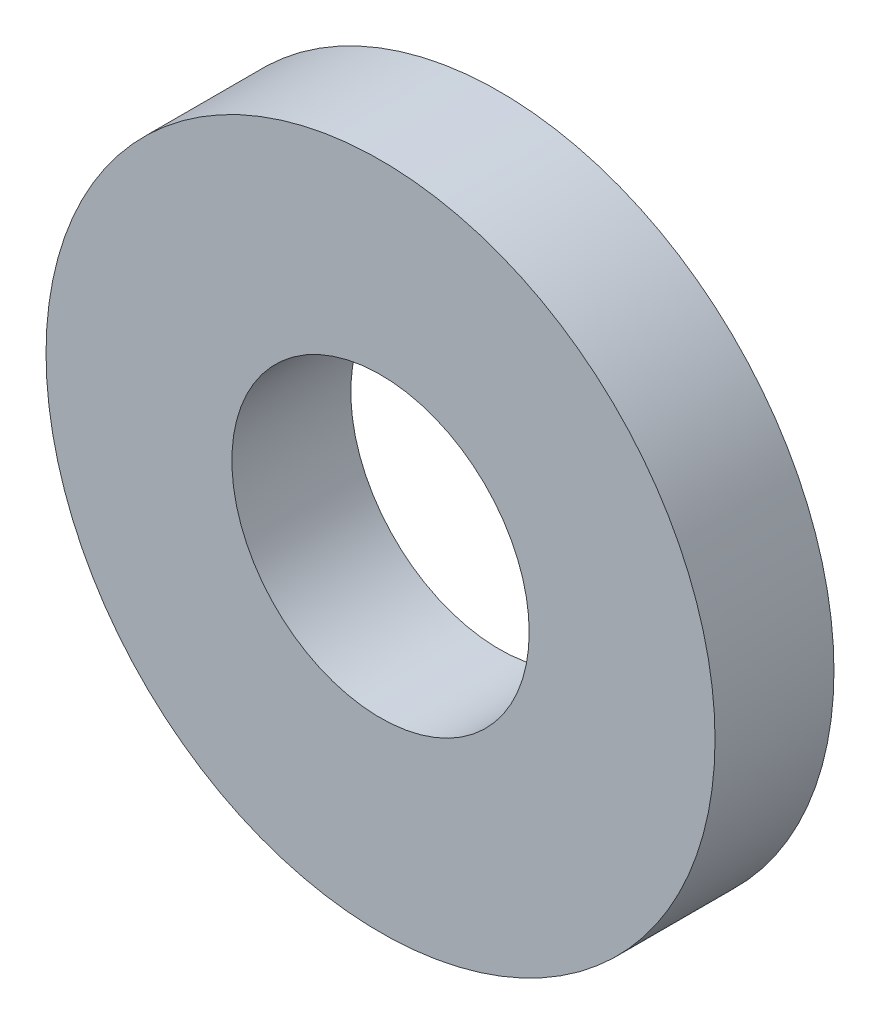
ISO-10303-21;
HEADER;
FILE_DESCRIPTION(('STEP AP214'),'2;1');
FILE_NAME('part.step','',(''),(''),'','','');
FILE_SCHEMA(('AUTOMOTIVE_DESIGN { 1 0 10303 214 1 1 1 1 }'));
ENDSEC;
DATA;
#1=APPLICATION_CONTEXT('core data for automotive mechanical design processes');
#2=APPLICATION_PROTOCOL_DEFINITION('international standard','automotive_design',2000,#1);
#3=PRODUCT_CONTEXT('',#1,'mechanical');
#4=PRODUCT('Part','Part','',(#3));
#5=PRODUCT_RELATED_PRODUCT_CATEGORY('part','',(#4));
#6=PRODUCT_DEFINITION_FORMATION('','',#4);
#7=PRODUCT_DEFINITION_CONTEXT('part definition',#1,'design');
#8=PRODUCT_DEFINITION('design','',#6,#7);
#9=PRODUCT_DEFINITION_SHAPE('','',#8);
#10=(LENGTH_UNIT() NAMED_UNIT(*) SI_UNIT(.MILLI.,.METRE.));
#11=(NAMED_UNIT(*) PLANE_ANGLE_UNIT() SI_UNIT($,.RADIAN.));
#12=(NAMED_UNIT(*) SI_UNIT($,.STERADIAN.) SOLID_ANGLE_UNIT());
#13=UNCERTAINTY_MEASURE_WITH_UNIT(LENGTH_MEASURE(1.E-05),#10,'distance_accuracy_value','');
#14=(GEOMETRIC_REPRESENTATION_CONTEXT(3) GLOBAL_UNCERTAINTY_ASSIGNED_CONTEXT((#13)) GLOBAL_UNIT_ASSIGNED_CONTEXT((#10,
#11,#12)) REPRESENTATION_CONTEXT('',''));
#15=CARTESIAN_POINT('',(0.,0.,0.));
#16=DIRECTION('',(0.,0.,1.));
#17=DIRECTION('',(1.,0.,0.));
#18=AXIS2_PLACEMENT_3D('',#15,#16,#17);
#19=CARTESIAN_POINT('',(0.,0.,8.));
#20=DIRECTION('',(0.,0.,1.));
#21=DIRECTION('',(1.,0.,0.));
#22=AXIS2_PLACEMENT_3D('',#19,#20,#21);
#23=PLANE('',#22);
#24=CARTESIAN_POINT('',(0.,0.,8.));
#25=DIRECTION('',(0.,0.,1.));
#26=DIRECTION('',(1.,0.,0.));
#27=AXIS2_PLACEMENT_3D('',#24,#25,#26);
#28=CIRCLE('',#27,22.5);
#29=CARTESIAN_POINT('',(22.5,0.,8.));
#30=VERTEX_POINT('',#29);
#31=EDGE_CURVE('E10',#30,#30,#28,.T.);
#32=ORIENTED_EDGE('',*,*,#31,.T.);
#33=EDGE_LOOP('',(#32));
#34=FACE_BOUND('',#33,.T.);
#35=CARTESIAN_POINT('',(0.,0.,8.));
#36=DIRECTION('',(0.,0.,1.));
#37=DIRECTION('',(1.,0.,0.));
#38=AXIS2_PLACEMENT_3D('',#35,#36,#37);
#39=CIRCLE('',#38,10.);
#40=CARTESIAN_POINT('',(10.,0.,8.));
#41=VERTEX_POINT('',#40);
#42=EDGE_CURVE('E56',#41,#41,#39,.T.);
#43=ORIENTED_EDGE('',*,*,#42,.F.);
#44=EDGE_LOOP('',(#43));
#45=FACE_BOUND('',#44,.T.);
#46=ADVANCED_FACE('F43',(#34,#45),#23,.T.);
#47=CARTESIAN_POINT('',(0.,0.,0.));
#48=DIRECTION('',(0.,0.,1.));
#49=DIRECTION('',(1.,0.,0.));
#50=AXIS2_PLACEMENT_3D('',#47,#48,#49);
#51=PLANE('',#50);
#52=CARTESIAN_POINT('',(0.,0.,0.));
#53=DIRECTION('',(0.,0.,1.));
#54=DIRECTION('',(1.,0.,0.));
#55=AXIS2_PLACEMENT_3D('',#52,#53,#54);
#56=CIRCLE('',#55,22.5);
#57=CARTESIAN_POINT('',(22.5,0.,0.));
#58=VERTEX_POINT('',#57);
#59=EDGE_CURVE('E47',#58,#58,#56,.T.);
#60=ORIENTED_EDGE('',*,*,#59,.F.);
#61=EDGE_LOOP('',(#60));
#62=FACE_BOUND('',#61,.T.);
#63=CARTESIAN_POINT('',(0.,0.,0.));
#64=DIRECTION('',(0.,0.,1.));
#65=DIRECTION('',(1.,0.,0.));
#66=AXIS2_PLACEMENT_3D('',#63,#64,#65);
#67=CIRCLE('',#66,10.);
#68=CARTESIAN_POINT('',(10.,0.,0.));
#69=VERTEX_POINT('',#68);
#70=EDGE_CURVE('E58',#69,#69,#67,.T.);
#71=ORIENTED_EDGE('',*,*,#70,.T.);
#72=EDGE_LOOP('',(#71));
#73=FACE_BOUND('',#72,.T.);
#74=ADVANCED_FACE('F70',(#62,#73),#51,.F.);
#75=CARTESIAN_POINT('',(0.,0.,8.));
#76=DIRECTION('',(0.,0.,-1.));
#77=DIRECTION('',(-1.,0.,0.));
#78=AXIS2_PLACEMENT_3D('',#75,#76,#77);
#79=CYLINDRICAL_SURFACE('',#78,22.5);
#80=ORIENTED_EDGE('',*,*,#31,.F.);
#81=EDGE_LOOP('',(#80));
#82=FACE_BOUND('',#81,.T.);
#83=ORIENTED_EDGE('',*,*,#59,.T.);
#84=EDGE_LOOP('',(#83));
#85=FACE_BOUND('',#84,.T.);
#86=ADVANCED_FACE('F45',(#82,#85),#79,.T.);
#87=CARTESIAN_POINT('',(0.,0.,8.));
#88=DIRECTION('',(0.,0.,-1.));
#89=DIRECTION('',(-1.,0.,0.));
#90=AXIS2_PLACEMENT_3D('',#87,#88,#89);
#91=CYLINDRICAL_SURFACE('',#90,10.);
#92=ORIENTED_EDGE('',*,*,#42,.T.);
#93=EDGE_LOOP('',(#92));
#94=FACE_BOUND('',#93,.T.);
#95=ORIENTED_EDGE('',*,*,#70,.F.);
#96=EDGE_LOOP('',(#95));
#97=FACE_BOUND('',#96,.T.);
#98=ADVANCED_FACE('F66',(#94,#97),#91,.F.);
#99=CLOSED_SHELL('',(#46,#74,#86,#98));
#100=MANIFOLD_SOLID_BREP('B2',#99);
#101=ADVANCED_BREP_SHAPE_REPRESENTATION('',(#18,#100),#14);
#102=SHAPE_DEFINITION_REPRESENTATION(#9,#101);
ENDSEC;
END-ISO-10303-21;
